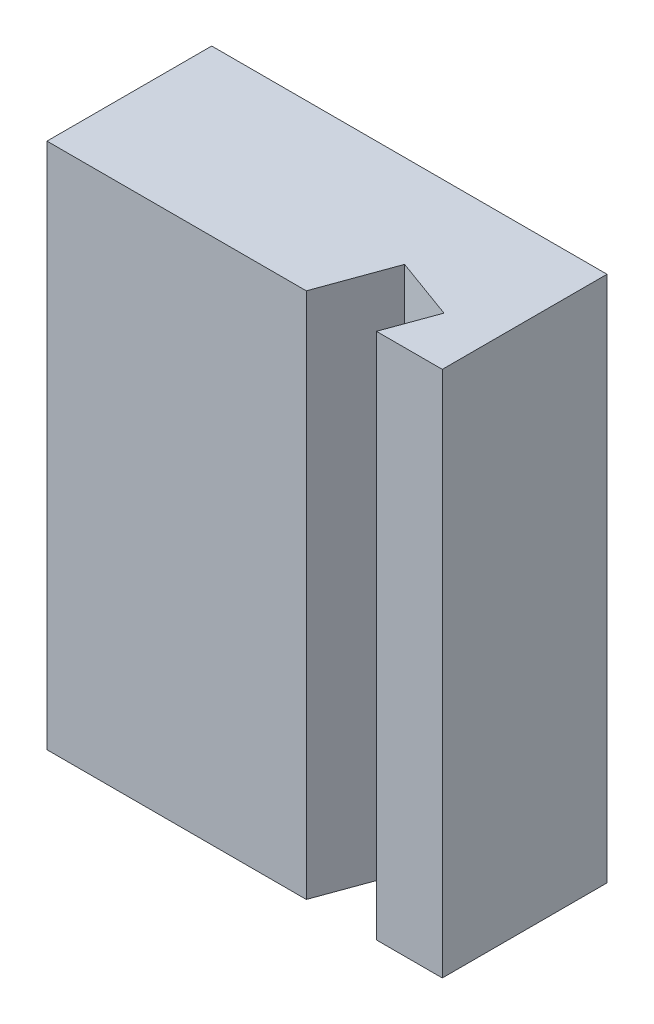
ISO-10303-21;
HEADER;
FILE_DESCRIPTION(('STEP AP214'),'2;1');
FILE_NAME('part.step','',(''),(''),'','','');
FILE_SCHEMA(('AUTOMOTIVE_DESIGN { 1 0 10303 214 1 1 1 1 }'));
ENDSEC;
DATA;
#1=APPLICATION_CONTEXT('core data for automotive mechanical design processes');
#2=APPLICATION_PROTOCOL_DEFINITION('international standard','automotive_design',2000,#1);
#3=PRODUCT_CONTEXT('',#1,'mechanical');
#4=PRODUCT('Part','Part','',(#3));
#5=PRODUCT_RELATED_PRODUCT_CATEGORY('part','',(#4));
#6=PRODUCT_DEFINITION_FORMATION('','',#4);
#7=PRODUCT_DEFINITION_CONTEXT('part definition',#1,'design');
#8=PRODUCT_DEFINITION('design','',#6,#7);
#9=PRODUCT_DEFINITION_SHAPE('','',#8);
#10=(LENGTH_UNIT() NAMED_UNIT(*) SI_UNIT(.MILLI.,.METRE.));
#11=(NAMED_UNIT(*) PLANE_ANGLE_UNIT() SI_UNIT($,.RADIAN.));
#12=(NAMED_UNIT(*) SI_UNIT($,.STERADIAN.) SOLID_ANGLE_UNIT());
#13=UNCERTAINTY_MEASURE_WITH_UNIT(LENGTH_MEASURE(1.E-05),#10,'distance_accuracy_value','');
#14=(GEOMETRIC_REPRESENTATION_CONTEXT(3) GLOBAL_UNCERTAINTY_ASSIGNED_CONTEXT((#13)) GLOBAL_UNIT_ASSIGNED_CONTEXT((#10,
#11,#12)) REPRESENTATION_CONTEXT('',''));
#15=CARTESIAN_POINT('',(0.,0.,0.));
#16=DIRECTION('',(0.,0.,1.));
#17=DIRECTION('',(1.,0.,0.));
#18=AXIS2_PLACEMENT_3D('',#15,#16,#17);
#19=CARTESIAN_POINT('',(30.,40.,12.5));
#20=DIRECTION('',(-1.,0.,0.));
#21=DIRECTION('',(0.,0.,1.));
#22=AXIS2_PLACEMENT_3D('',#19,#20,#21);
#23=PLANE('',#22);
#24=DIRECTION('',(0.,0.,-1.));
#25=VECTOR('',#24,1.);
#26=CARTESIAN_POINT('',(30.,-40.,12.5));
#27=LINE('',#26,#25);
#28=CARTESIAN_POINT('',(30.,-40.,12.5));
#29=VERTEX_POINT('',#28);
#30=CARTESIAN_POINT('',(30.,-40.,-12.5));
#31=VERTEX_POINT('',#30);
#32=EDGE_CURVE('E133',#29,#31,#27,.T.);
#33=ORIENTED_EDGE('',*,*,#32,.T.);
#34=DIRECTION('',(0.,-1.,0.));
#35=VECTOR('',#34,1.);
#36=CARTESIAN_POINT('',(30.,40.,-12.5));
#37=LINE('',#36,#35);
#38=CARTESIAN_POINT('',(30.,40.,-12.5));
#39=VERTEX_POINT('',#38);
#40=EDGE_CURVE('E11',#39,#31,#37,.T.);
#41=ORIENTED_EDGE('',*,*,#40,.F.);
#42=DIRECTION('',(0.,0.,-1.));
#43=VECTOR('',#42,1.);
#44=CARTESIAN_POINT('',(30.,40.,12.5));
#45=LINE('',#44,#43);
#46=CARTESIAN_POINT('',(30.,40.,12.5));
#47=VERTEX_POINT('',#46);
#48=EDGE_CURVE('E149',#47,#39,#45,.T.);
#49=ORIENTED_EDGE('',*,*,#48,.F.);
#50=DIRECTION('',(0.,-1.,0.));
#51=VECTOR('',#50,1.);
#52=CARTESIAN_POINT('',(30.,40.,12.5));
#53=LINE('',#52,#51);
#54=EDGE_CURVE('E132',#47,#29,#53,.T.);
#55=ORIENTED_EDGE('',*,*,#54,.T.);
#56=EDGE_LOOP('',(#33,#41,#49,#55));
#57=FACE_BOUND('',#56,.T.);
#58=ADVANCED_FACE('F39',(#57),#23,.F.);
#59=CARTESIAN_POINT('',(-30.,40.,-12.5));
#60=DIRECTION('',(0.,0.,1.));
#61=DIRECTION('',(1.,0.,0.));
#62=AXIS2_PLACEMENT_3D('',#59,#60,#61);
#63=PLANE('',#62);
#64=DIRECTION('',(-1.,0.,0.));
#65=VECTOR('',#64,1.);
#66=CARTESIAN_POINT('',(-30.,-40.,-12.5));
#67=LINE('',#66,#65);
#68=CARTESIAN_POINT('',(-30.,-40.,-12.5));
#69=VERTEX_POINT('',#68);
#70=EDGE_CURVE('E140',#31,#69,#67,.T.);
#71=ORIENTED_EDGE('',*,*,#70,.T.);
#72=DIRECTION('',(0.,-1.,0.));
#73=VECTOR('',#72,1.);
#74=CARTESIAN_POINT('',(-30.,40.,-12.5));
#75=LINE('',#74,#73);
#76=CARTESIAN_POINT('',(-30.,40.,-12.5));
#77=VERTEX_POINT('',#76);
#78=EDGE_CURVE('E50',#77,#69,#75,.T.);
#79=ORIENTED_EDGE('',*,*,#78,.F.);
#80=DIRECTION('',(-1.,0.,0.));
#81=VECTOR('',#80,1.);
#82=CARTESIAN_POINT('',(-30.,40.,-12.5));
#83=LINE('',#82,#81);
#84=EDGE_CURVE('E98',#39,#77,#83,.T.);
#85=ORIENTED_EDGE('',*,*,#84,.F.);
#86=ORIENTED_EDGE('',*,*,#40,.T.);
#87=EDGE_LOOP('',(#71,#79,#85,#86));
#88=FACE_BOUND('',#87,.T.);
#89=ADVANCED_FACE('F184',(#88),#63,.F.);
#90=CARTESIAN_POINT('',(-30.,40.,12.5));
#91=DIRECTION('',(1.,0.,0.));
#92=DIRECTION('',(0.,0.,-1.));
#93=AXIS2_PLACEMENT_3D('',#90,#91,#92);
#94=PLANE('',#93);
#95=DIRECTION('',(0.,0.,1.));
#96=VECTOR('',#95,1.);
#97=CARTESIAN_POINT('',(-30.,-40.,12.5));
#98=LINE('',#97,#96);
#99=CARTESIAN_POINT('',(-30.,-40.,12.5));
#100=VERTEX_POINT('',#99);
#101=EDGE_CURVE('E138',#69,#100,#98,.T.);
#102=ORIENTED_EDGE('',*,*,#101,.T.);
#103=DIRECTION('',(0.,-1.,0.));
#104=VECTOR('',#103,1.);
#105=CARTESIAN_POINT('',(-30.,40.,12.5));
#106=LINE('',#105,#104);
#107=CARTESIAN_POINT('',(-30.,40.,12.5));
#108=VERTEX_POINT('',#107);
#109=EDGE_CURVE('E156',#108,#100,#106,.T.);
#110=ORIENTED_EDGE('',*,*,#109,.F.);
#111=DIRECTION('',(0.,0.,1.));
#112=VECTOR('',#111,1.);
#113=CARTESIAN_POINT('',(-30.,40.,12.5));
#114=LINE('',#113,#112);
#115=EDGE_CURVE('E163',#77,#108,#114,.T.);
#116=ORIENTED_EDGE('',*,*,#115,.F.);
#117=ORIENTED_EDGE('',*,*,#78,.T.);
#118=EDGE_LOOP('',(#102,#110,#116,#117));
#119=FACE_BOUND('',#118,.T.);
#120=ADVANCED_FACE('F165',(#119),#94,.F.);
#121=CARTESIAN_POINT('',(-30.,40.,12.5));
#122=DIRECTION('',(0.,0.,-1.));
#123=DIRECTION('',(-1.,0.,0.));
#124=AXIS2_PLACEMENT_3D('',#121,#122,#123);
#125=PLANE('',#124);
#126=DIRECTION('',(1.,0.,0.));
#127=VECTOR('',#126,1.);
#128=CARTESIAN_POINT('',(-30.,-40.,12.5));
#129=LINE('',#128,#127);
#130=CARTESIAN_POINT('',(9.35822227524088,-40.,12.5));
#131=VERTEX_POINT('',#130);
#132=EDGE_CURVE('E142',#100,#131,#129,.T.);
#133=ORIENTED_EDGE('',*,*,#132,.T.);
#134=DIRECTION('',(0.,-1.,0.));
#135=VECTOR('',#134,1.);
#136=CARTESIAN_POINT('',(9.35822227524088,40.,12.5));
#137=LINE('',#136,#135);
#138=CARTESIAN_POINT('',(9.35822227524088,40.,12.5));
#139=VERTEX_POINT('',#138);
#140=EDGE_CURVE('E153',#139,#131,#137,.T.);
#141=ORIENTED_EDGE('',*,*,#140,.F.);
#142=DIRECTION('',(1.,0.,0.));
#143=VECTOR('',#142,1.);
#144=CARTESIAN_POINT('',(-30.,40.,12.5));
#145=LINE('',#144,#143);
#146=EDGE_CURVE('E177',#108,#139,#145,.T.);
#147=ORIENTED_EDGE('',*,*,#146,.F.);
#148=ORIENTED_EDGE('',*,*,#109,.T.);
#149=EDGE_LOOP('',(#133,#141,#147,#148));
#150=FACE_BOUND('',#149,.T.);
#151=ADVANCED_FACE('F175',(#150),#125,.F.);
#152=CARTESIAN_POINT('',(13.3392349387463,40.,1.56225760045604));
#153=DIRECTION('',(-0.939692620785908,0.,-0.342020143325669));
#154=DIRECTION('',(-0.342020143325669,0.,0.939692620785908));
#155=AXIS2_PLACEMENT_3D('',#152,#153,#154);
#156=PLANE('',#155);
#157=DIRECTION('',(0.342020143325669,0.,-0.939692620785908));
#158=VECTOR('',#157,1.);
#159=CARTESIAN_POINT('',(13.3392349387463,-40.,1.56225760045604));
#160=LINE('',#159,#158);
#161=CARTESIAN_POINT('',(13.3392349387463,-40.,1.56225760045604));
#162=VERTEX_POINT('',#161);
#163=EDGE_CURVE('E145',#131,#162,#160,.T.);
#164=ORIENTED_EDGE('',*,*,#163,.T.);
#165=DIRECTION('',(0.,-1.,0.));
#166=VECTOR('',#165,1.);
#167=CARTESIAN_POINT('',(13.3392349387463,40.,1.56225760045604));
#168=LINE('',#167,#166);
#169=CARTESIAN_POINT('',(13.3392349387463,40.,1.56225760045604));
#170=VERTEX_POINT('',#169);
#171=EDGE_CURVE('E127',#170,#162,#168,.T.);
#172=ORIENTED_EDGE('',*,*,#171,.F.);
#173=DIRECTION('',(0.342020143325669,0.,-0.939692620785908));
#174=VECTOR('',#173,1.);
#175=CARTESIAN_POINT('',(13.3392349387463,40.,1.56225760045604));
#176=LINE('',#175,#174);
#177=EDGE_CURVE('E120',#139,#170,#176,.T.);
#178=ORIENTED_EDGE('',*,*,#177,.F.);
#179=ORIENTED_EDGE('',*,*,#140,.T.);
#180=EDGE_LOOP('',(#164,#172,#178,#179));
#181=FACE_BOUND('',#180,.T.);
#182=ADVANCED_FACE('F173',(#181),#156,.F.);
#183=CARTESIAN_POINT('',(22.7361611466054,40.,4.98245903371273));
#184=DIRECTION('',(0.342020143325669,0.,-0.939692620785908));
#185=DIRECTION('',(-0.939692620785908,0.,-0.342020143325669));
#186=AXIS2_PLACEMENT_3D('',#183,#184,#185);
#187=PLANE('',#186);
#188=DIRECTION('',(0.939692620785908,0.,0.342020143325669));
#189=VECTOR('',#188,1.);
#190=CARTESIAN_POINT('',(22.7361611466054,-40.,4.98245903371273));
#191=LINE('',#190,#189);
#192=CARTESIAN_POINT('',(22.7361611466054,-40.,4.98245903371273));
#193=VERTEX_POINT('',#192);
#194=EDGE_CURVE('E123',#162,#193,#191,.T.);
#195=ORIENTED_EDGE('',*,*,#194,.T.);
#196=DIRECTION('',(0.,-1.,0.));
#197=VECTOR('',#196,1.);
#198=CARTESIAN_POINT('',(22.7361611466054,40.,4.98245903371273));
#199=LINE('',#198,#197);
#200=CARTESIAN_POINT('',(22.7361611466054,40.,4.98245903371273));
#201=VERTEX_POINT('',#200);
#202=EDGE_CURVE('E124',#201,#193,#199,.T.);
#203=ORIENTED_EDGE('',*,*,#202,.F.);
#204=DIRECTION('',(0.939692620785908,0.,0.342020143325669));
#205=VECTOR('',#204,1.);
#206=CARTESIAN_POINT('',(22.7361611466054,40.,4.98245903371273));
#207=LINE('',#206,#205);
#208=EDGE_CURVE('E112',#170,#201,#207,.T.);
#209=ORIENTED_EDGE('',*,*,#208,.F.);
#210=ORIENTED_EDGE('',*,*,#171,.T.);
#211=EDGE_LOOP('',(#195,#203,#209,#210));
#212=FACE_BOUND('',#211,.T.);
#213=ADVANCED_FACE('F125',(#212),#187,.F.);
#214=CARTESIAN_POINT('',(20.,40.,12.5));
#215=DIRECTION('',(0.939692620785908,0.,0.342020143325669));
#216=DIRECTION('',(0.342020143325669,0.,-0.939692620785908));
#217=AXIS2_PLACEMENT_3D('',#214,#215,#216);
#218=PLANE('',#217);
#219=DIRECTION('',(-0.342020143325669,0.,0.939692620785908));
#220=VECTOR('',#219,1.);
#221=CARTESIAN_POINT('',(20.,-40.,12.5));
#222=LINE('',#221,#220);
#223=CARTESIAN_POINT('',(20.,-40.,12.5));
#224=VERTEX_POINT('',#223);
#225=EDGE_CURVE('E81',#193,#224,#222,.T.);
#226=ORIENTED_EDGE('',*,*,#225,.T.);
#227=DIRECTION('',(0.,-1.,0.));
#228=VECTOR('',#227,1.);
#229=CARTESIAN_POINT('',(20.,40.,12.5));
#230=LINE('',#229,#228);
#231=CARTESIAN_POINT('',(20.,40.,12.5));
#232=VERTEX_POINT('',#231);
#233=EDGE_CURVE('E130',#232,#224,#230,.T.);
#234=ORIENTED_EDGE('',*,*,#233,.F.);
#235=DIRECTION('',(-0.342020143325669,0.,0.939692620785908));
#236=VECTOR('',#235,1.);
#237=CARTESIAN_POINT('',(20.,40.,12.5));
#238=LINE('',#237,#236);
#239=EDGE_CURVE('E113',#201,#232,#238,.T.);
#240=ORIENTED_EDGE('',*,*,#239,.F.);
#241=ORIENTED_EDGE('',*,*,#202,.T.);
#242=EDGE_LOOP('',(#226,#234,#240,#241));
#243=FACE_BOUND('',#242,.T.);
#244=ADVANCED_FACE('F129',(#243),#218,.F.);
#245=CARTESIAN_POINT('',(20.,40.,12.5));
#246=DIRECTION('',(0.,0.,-1.));
#247=DIRECTION('',(-1.,0.,0.));
#248=AXIS2_PLACEMENT_3D('',#245,#246,#247);
#249=PLANE('',#248);
#250=DIRECTION('',(1.,0.,0.));
#251=VECTOR('',#250,1.);
#252=CARTESIAN_POINT('',(20.,-40.,12.5));
#253=LINE('',#252,#251);
#254=EDGE_CURVE('E89',#224,#29,#253,.T.);
#255=ORIENTED_EDGE('',*,*,#254,.T.);
#256=ORIENTED_EDGE('',*,*,#54,.F.);
#257=DIRECTION('',(1.,0.,0.));
#258=VECTOR('',#257,1.);
#259=CARTESIAN_POINT('',(20.,40.,12.5));
#260=LINE('',#259,#258);
#261=EDGE_CURVE('E54',#232,#47,#260,.T.);
#262=ORIENTED_EDGE('',*,*,#261,.F.);
#263=ORIENTED_EDGE('',*,*,#233,.T.);
#264=EDGE_LOOP('',(#255,#256,#262,#263));
#265=FACE_BOUND('',#264,.T.);
#266=ADVANCED_FACE('F199',(#265),#249,.F.);
#267=CARTESIAN_POINT('',(0.,40.,0.));
#268=DIRECTION('',(0.,-1.,0.));
#269=DIRECTION('',(0.,0.,-1.));
#270=AXIS2_PLACEMENT_3D('',#267,#268,#269);
#271=PLANE('',#270);
#272=ORIENTED_EDGE('',*,*,#48,.T.);
#273=ORIENTED_EDGE('',*,*,#84,.T.);
#274=ORIENTED_EDGE('',*,*,#115,.T.);
#275=ORIENTED_EDGE('',*,*,#146,.T.);
#276=ORIENTED_EDGE('',*,*,#177,.T.);
#277=ORIENTED_EDGE('',*,*,#208,.T.);
#278=ORIENTED_EDGE('',*,*,#239,.T.);
#279=ORIENTED_EDGE('',*,*,#261,.T.);
#280=EDGE_LOOP('',(#272,#273,#274,#275,#276,#277,#278,#279));
#281=FACE_BOUND('',#280,.T.);
#282=ADVANCED_FACE('F114',(#281),#271,.F.);
#283=CARTESIAN_POINT('',(0.,-40.,0.));
#284=DIRECTION('',(0.,-1.,0.));
#285=DIRECTION('',(0.,0.,-1.));
#286=AXIS2_PLACEMENT_3D('',#283,#284,#285);
#287=PLANE('',#286);
#288=ORIENTED_EDGE('',*,*,#32,.F.);
#289=ORIENTED_EDGE('',*,*,#254,.F.);
#290=ORIENTED_EDGE('',*,*,#225,.F.);
#291=ORIENTED_EDGE('',*,*,#194,.F.);
#292=ORIENTED_EDGE('',*,*,#163,.F.);
#293=ORIENTED_EDGE('',*,*,#132,.F.);
#294=ORIENTED_EDGE('',*,*,#101,.F.);
#295=ORIENTED_EDGE('',*,*,#70,.F.);
#296=EDGE_LOOP('',(#288,#289,#290,#291,#292,#293,#294,#295));
#297=FACE_BOUND('',#296,.T.);
#298=ADVANCED_FACE('F169',(#297),#287,.T.);
#299=CLOSED_SHELL('',(#58,#89,#120,#151,#182,#213,#244,#266,#282,#298));
#300=MANIFOLD_SOLID_BREP('B2',#299);
#301=ADVANCED_BREP_SHAPE_REPRESENTATION('',(#18,#300),#14);
#302=SHAPE_DEFINITION_REPRESENTATION(#9,#301);
ENDSEC;
END-ISO-10303-21;
